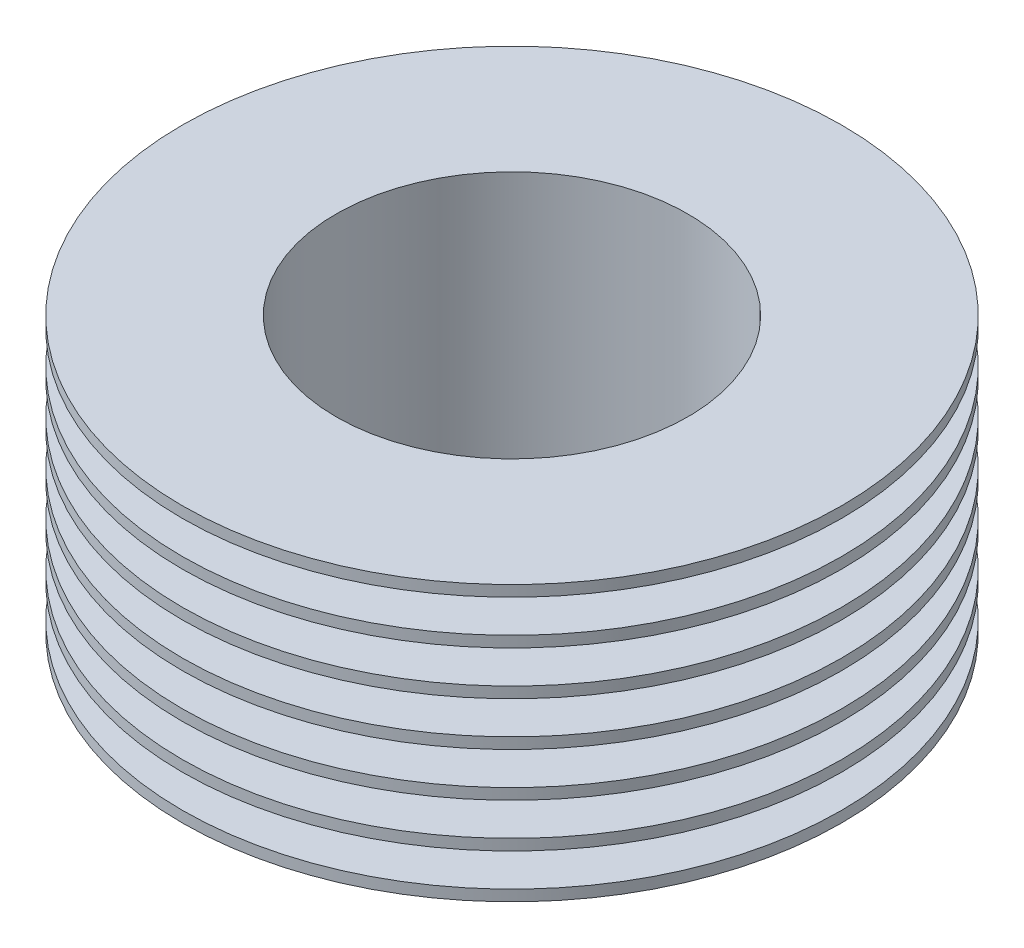
ISO-10303-21;
HEADER;
FILE_DESCRIPTION(('STEP AP214'),'2;1');
FILE_NAME('part.step','',(''),(''),'','','');
FILE_SCHEMA(('AUTOMOTIVE_DESIGN { 1 0 10303 214 1 1 1 1 }'));
ENDSEC;
DATA;
#1=APPLICATION_CONTEXT('core data for automotive mechanical design processes');
#2=APPLICATION_PROTOCOL_DEFINITION('international standard','automotive_design',2000,#1);
#3=PRODUCT_CONTEXT('',#1,'mechanical');
#4=PRODUCT('Part','Part','',(#3));
#5=PRODUCT_RELATED_PRODUCT_CATEGORY('part','',(#4));
#6=PRODUCT_DEFINITION_FORMATION('','',#4);
#7=PRODUCT_DEFINITION_CONTEXT('part definition',#1,'design');
#8=PRODUCT_DEFINITION('design','',#6,#7);
#9=PRODUCT_DEFINITION_SHAPE('','',#8);
#10=(LENGTH_UNIT() NAMED_UNIT(*) SI_UNIT(.MILLI.,.METRE.));
#11=(NAMED_UNIT(*) PLANE_ANGLE_UNIT() SI_UNIT($,.RADIAN.));
#12=(NAMED_UNIT(*) SI_UNIT($,.STERADIAN.) SOLID_ANGLE_UNIT());
#13=UNCERTAINTY_MEASURE_WITH_UNIT(LENGTH_MEASURE(1.E-05),#10,'distance_accuracy_value','');
#14=(GEOMETRIC_REPRESENTATION_CONTEXT(3) GLOBAL_UNCERTAINTY_ASSIGNED_CONTEXT((#13)) GLOBAL_UNIT_ASSIGNED_CONTEXT((#10,
#11,#12)) REPRESENTATION_CONTEXT('',''));
#15=CARTESIAN_POINT('',(0.,0.,0.));
#16=DIRECTION('',(0.,0.,1.));
#17=DIRECTION('',(1.,0.,0.));
#18=AXIS2_PLACEMENT_3D('',#15,#16,#17);
#19=CARTESIAN_POINT('',(0.,28.0586262240942,0.));
#20=DIRECTION('',(0.,1.,0.));
#21=DIRECTION('',(0.,0.,1.));
#22=AXIS2_PLACEMENT_3D('',#19,#20,#21);
#23=CYLINDRICAL_SURFACE('',#22,16.);
#24=CARTESIAN_POINT('',(0.,8.83865887189124,0.));
#25=DIRECTION('',(0.,1.,0.));
#26=DIRECTION('',(0.,0.,1.));
#27=AXIS2_PLACEMENT_3D('',#24,#25,#26);
#28=CIRCLE('',#27,16.);
#29=CARTESIAN_POINT('',(0.,8.83865887189124,16.));
#30=VERTEX_POINT('',#29);
#31=EDGE_CURVE('E67',#30,#30,#28,.T.);
#32=ORIENTED_EDGE('',*,*,#31,.F.);
#33=EDGE_LOOP('',(#32));
#34=FACE_BOUND('',#33,.T.);
#35=CARTESIAN_POINT('',(0.,33.8386588718912,0.));
#36=DIRECTION('',(0.,1.,0.));
#37=DIRECTION('',(0.,0.,1.));
#38=AXIS2_PLACEMENT_3D('',#35,#36,#37);
#39=CIRCLE('',#38,16.);
#40=CARTESIAN_POINT('',(0.,33.8386588718912,16.));
#41=VERTEX_POINT('',#40);
#42=EDGE_CURVE('E123',#41,#41,#39,.T.);
#43=ORIENTED_EDGE('',*,*,#42,.T.);
#44=EDGE_LOOP('',(#43));
#45=FACE_BOUND('',#44,.T.);
#46=ADVANCED_FACE('F34',(#34,#45),#23,.F.);
#47=CARTESIAN_POINT('',(0.,28.0586262240942,0.));
#48=DIRECTION('',(0.,1.,0.));
#49=DIRECTION('',(0.,0.,1.));
#50=AXIS2_PLACEMENT_3D('',#47,#48,#49);
#51=CYLINDRICAL_SURFACE('',#50,18.);
#52=CARTESIAN_POINT('',(0.,12.8386588718912,0.));
#53=DIRECTION('',(0.,-1.,0.));
#54=DIRECTION('',(0.,0.,-1.));
#55=AXIS2_PLACEMENT_3D('',#52,#53,#54);
#56=CIRCLE('',#55,18.);
#57=CARTESIAN_POINT('',(0.,12.8386588718912,-18.));
#58=VERTEX_POINT('',#57);
#59=EDGE_CURVE('E57',#58,#58,#56,.F.);
#60=ORIENTED_EDGE('',*,*,#59,.F.);
#61=EDGE_LOOP('',(#60));
#62=FACE_BOUND('',#61,.T.);
#63=CARTESIAN_POINT('',(0.,9.83865887189124,0.));
#64=DIRECTION('',(0.,1.,0.));
#65=DIRECTION('',(0.,0.,1.));
#66=AXIS2_PLACEMENT_3D('',#63,#64,#65);
#67=CIRCLE('',#66,18.);
#68=CARTESIAN_POINT('',(0.,9.83865887189124,18.));
#69=VERTEX_POINT('',#68);
#70=EDGE_CURVE('E58',#69,#69,#67,.T.);
#71=ORIENTED_EDGE('',*,*,#70,.T.);
#72=EDGE_LOOP('',(#71));
#73=FACE_BOUND('',#72,.T.);
#74=ADVANCED_FACE('F36',(#62,#73),#51,.T.);
#75=CARTESIAN_POINT('',(0.,9.83865887189124,18.));
#76=DIRECTION('',(0.,1.,0.));
#77=DIRECTION('',(0.,0.,1.));
#78=AXIS2_PLACEMENT_3D('',#75,#76,#77);
#79=PLANE('',#78);
#80=CARTESIAN_POINT('',(0.,9.83865887189124,0.));
#81=DIRECTION('',(0.,1.,0.));
#82=DIRECTION('',(0.,0.,1.));
#83=AXIS2_PLACEMENT_3D('',#80,#81,#82);
#84=CIRCLE('',#83,30.);
#85=CARTESIAN_POINT('',(0.,9.83865887189124,30.));
#86=VERTEX_POINT('',#85);
#87=EDGE_CURVE('E61',#86,#86,#84,.T.);
#88=ORIENTED_EDGE('',*,*,#87,.T.);
#89=EDGE_LOOP('',(#88));
#90=FACE_BOUND('',#89,.T.);
#91=ORIENTED_EDGE('',*,*,#70,.F.);
#92=EDGE_LOOP('',(#91));
#93=FACE_BOUND('',#92,.T.);
#94=ADVANCED_FACE('F149',(#90,#93),#79,.T.);
#95=CARTESIAN_POINT('',(0.,28.0586262240942,0.));
#96=DIRECTION('',(0.,1.,0.));
#97=DIRECTION('',(0.,0.,1.));
#98=AXIS2_PLACEMENT_3D('',#95,#96,#97);
#99=CYLINDRICAL_SURFACE('',#98,30.);
#100=CARTESIAN_POINT('',(0.,8.83865887189124,0.));
#101=DIRECTION('',(0.,1.,0.));
#102=DIRECTION('',(0.,0.,1.));
#103=AXIS2_PLACEMENT_3D('',#100,#101,#102);
#104=CIRCLE('',#103,30.);
#105=CARTESIAN_POINT('',(0.,8.83865887189124,30.));
#106=VERTEX_POINT('',#105);
#107=EDGE_CURVE('E64',#106,#106,#104,.T.);
#108=ORIENTED_EDGE('',*,*,#107,.T.);
#109=EDGE_LOOP('',(#108));
#110=FACE_BOUND('',#109,.T.);
#111=ORIENTED_EDGE('',*,*,#87,.F.);
#112=EDGE_LOOP('',(#111));
#113=FACE_BOUND('',#112,.T.);
#114=ADVANCED_FACE('F159',(#110,#113),#99,.T.);
#115=CARTESIAN_POINT('',(0.,8.83865887189124,30.));
#116=DIRECTION('',(0.,-1.,0.));
#117=DIRECTION('',(0.,0.,-1.));
#118=AXIS2_PLACEMENT_3D('',#115,#116,#117);
#119=PLANE('',#118);
#120=ORIENTED_EDGE('',*,*,#31,.T.);
#121=EDGE_LOOP('',(#120));
#122=FACE_BOUND('',#121,.T.);
#123=ORIENTED_EDGE('',*,*,#107,.F.);
#124=EDGE_LOOP('',(#123));
#125=FACE_BOUND('',#124,.T.);
#126=ADVANCED_FACE('F156',(#122,#125),#119,.T.);
#127=CARTESIAN_POINT('',(0.,32.0586262240942,0.));
#128=DIRECTION('',(0.,1.,0.));
#129=DIRECTION('',(0.,0.,1.));
#130=AXIS2_PLACEMENT_3D('',#127,#128,#129);
#131=CYLINDRICAL_SURFACE('',#130,18.);
#132=CARTESIAN_POINT('',(0.,16.8386588718912,0.));
#133=DIRECTION('',(0.,-1.,0.));
#134=DIRECTION('',(0.,0.,-1.));
#135=AXIS2_PLACEMENT_3D('',#132,#133,#134);
#136=CIRCLE('',#135,18.);
#137=CARTESIAN_POINT('',(0.,16.8386588718912,-18.));
#138=VERTEX_POINT('',#137);
#139=EDGE_CURVE('E54',#138,#138,#136,.F.);
#140=ORIENTED_EDGE('',*,*,#139,.F.);
#141=EDGE_LOOP('',(#140));
#142=FACE_BOUND('',#141,.T.);
#143=CARTESIAN_POINT('',(0.,13.8386588718912,0.));
#144=DIRECTION('',(0.,1.,0.));
#145=DIRECTION('',(0.,0.,1.));
#146=AXIS2_PLACEMENT_3D('',#143,#144,#145);
#147=CIRCLE('',#146,18.);
#148=CARTESIAN_POINT('',(0.,13.8386588718912,18.));
#149=VERTEX_POINT('',#148);
#150=EDGE_CURVE('E70',#149,#149,#147,.T.);
#151=ORIENTED_EDGE('',*,*,#150,.T.);
#152=EDGE_LOOP('',(#151));
#153=FACE_BOUND('',#152,.T.);
#154=ADVANCED_FACE('F154',(#142,#153),#131,.T.);
#155=CARTESIAN_POINT('',(0.,13.8386588718912,18.));
#156=DIRECTION('',(0.,1.,0.));
#157=DIRECTION('',(0.,0.,1.));
#158=AXIS2_PLACEMENT_3D('',#155,#156,#157);
#159=PLANE('',#158);
#160=CARTESIAN_POINT('',(0.,13.8386588718912,0.));
#161=DIRECTION('',(0.,1.,0.));
#162=DIRECTION('',(0.,0.,1.));
#163=AXIS2_PLACEMENT_3D('',#160,#161,#162);
#164=CIRCLE('',#163,30.);
#165=CARTESIAN_POINT('',(0.,13.8386588718912,30.));
#166=VERTEX_POINT('',#165);
#167=EDGE_CURVE('E75',#166,#166,#164,.T.);
#168=ORIENTED_EDGE('',*,*,#167,.T.);
#169=EDGE_LOOP('',(#168));
#170=FACE_BOUND('',#169,.T.);
#171=ORIENTED_EDGE('',*,*,#150,.F.);
#172=EDGE_LOOP('',(#171));
#173=FACE_BOUND('',#172,.T.);
#174=ADVANCED_FACE('F188',(#170,#173),#159,.T.);
#175=CARTESIAN_POINT('',(0.,32.0586262240942,0.));
#176=DIRECTION('',(0.,1.,0.));
#177=DIRECTION('',(0.,0.,1.));
#178=AXIS2_PLACEMENT_3D('',#175,#176,#177);
#179=CYLINDRICAL_SURFACE('',#178,30.);
#180=CARTESIAN_POINT('',(0.,12.8386588718912,0.));
#181=DIRECTION('',(0.,1.,0.));
#182=DIRECTION('',(0.,0.,1.));
#183=AXIS2_PLACEMENT_3D('',#180,#181,#182);
#184=CIRCLE('',#183,30.);
#185=CARTESIAN_POINT('',(0.,12.8386588718912,30.));
#186=VERTEX_POINT('',#185);
#187=EDGE_CURVE('E78',#186,#186,#184,.T.);
#188=ORIENTED_EDGE('',*,*,#187,.T.);
#189=EDGE_LOOP('',(#188));
#190=FACE_BOUND('',#189,.T.);
#191=ORIENTED_EDGE('',*,*,#167,.F.);
#192=EDGE_LOOP('',(#191));
#193=FACE_BOUND('',#192,.T.);
#194=ADVANCED_FACE('F195',(#190,#193),#179,.T.);
#195=CARTESIAN_POINT('',(0.,12.8386588718912,30.));
#196=DIRECTION('',(0.,-1.,0.));
#197=DIRECTION('',(0.,0.,-1.));
#198=AXIS2_PLACEMENT_3D('',#195,#196,#197);
#199=PLANE('',#198);
#200=ORIENTED_EDGE('',*,*,#59,.T.);
#201=EDGE_LOOP('',(#200));
#202=FACE_BOUND('',#201,.T.);
#203=ORIENTED_EDGE('',*,*,#187,.F.);
#204=EDGE_LOOP('',(#203));
#205=FACE_BOUND('',#204,.T.);
#206=ADVANCED_FACE('F202',(#202,#205),#199,.T.);
#207=CARTESIAN_POINT('',(0.,36.0586262240942,0.));
#208=DIRECTION('',(0.,1.,0.));
#209=DIRECTION('',(0.,0.,1.));
#210=AXIS2_PLACEMENT_3D('',#207,#208,#209);
#211=CYLINDRICAL_SURFACE('',#210,18.);
#212=CARTESIAN_POINT('',(0.,20.8386588718912,0.));
#213=DIRECTION('',(0.,-1.,0.));
#214=DIRECTION('',(0.,0.,-1.));
#215=AXIS2_PLACEMENT_3D('',#212,#213,#214);
#216=CIRCLE('',#215,18.);
#217=CARTESIAN_POINT('',(0.,20.8386588718912,-18.));
#218=VERTEX_POINT('',#217);
#219=EDGE_CURVE('E49',#218,#218,#216,.F.);
#220=ORIENTED_EDGE('',*,*,#219,.F.);
#221=EDGE_LOOP('',(#220));
#222=FACE_BOUND('',#221,.T.);
#223=CARTESIAN_POINT('',(0.,17.8386588718912,0.));
#224=DIRECTION('',(0.,1.,0.));
#225=DIRECTION('',(0.,0.,1.));
#226=AXIS2_PLACEMENT_3D('',#223,#224,#225);
#227=CIRCLE('',#226,18.);
#228=CARTESIAN_POINT('',(0.,17.8386588718912,18.));
#229=VERTEX_POINT('',#228);
#230=EDGE_CURVE('E81',#229,#229,#227,.T.);
#231=ORIENTED_EDGE('',*,*,#230,.T.);
#232=EDGE_LOOP('',(#231));
#233=FACE_BOUND('',#232,.T.);
#234=ADVANCED_FACE('F210',(#222,#233),#211,.T.);
#235=CARTESIAN_POINT('',(0.,17.8386588718912,18.));
#236=DIRECTION('',(0.,1.,0.));
#237=DIRECTION('',(0.,0.,1.));
#238=AXIS2_PLACEMENT_3D('',#235,#236,#237);
#239=PLANE('',#238);
#240=CARTESIAN_POINT('',(0.,17.8386588718912,0.));
#241=DIRECTION('',(0.,1.,0.));
#242=DIRECTION('',(0.,0.,1.));
#243=AXIS2_PLACEMENT_3D('',#240,#241,#242);
#244=CIRCLE('',#243,30.);
#245=CARTESIAN_POINT('',(0.,17.8386588718912,30.));
#246=VERTEX_POINT('',#245);
#247=EDGE_CURVE('E84',#246,#246,#244,.T.);
#248=ORIENTED_EDGE('',*,*,#247,.T.);
#249=EDGE_LOOP('',(#248));
#250=FACE_BOUND('',#249,.T.);
#251=ORIENTED_EDGE('',*,*,#230,.F.);
#252=EDGE_LOOP('',(#251));
#253=FACE_BOUND('',#252,.T.);
#254=ADVANCED_FACE('F218',(#250,#253),#239,.T.);
#255=CARTESIAN_POINT('',(0.,36.0586262240942,0.));
#256=DIRECTION('',(0.,1.,0.));
#257=DIRECTION('',(0.,0.,1.));
#258=AXIS2_PLACEMENT_3D('',#255,#256,#257);
#259=CYLINDRICAL_SURFACE('',#258,30.);
#260=CARTESIAN_POINT('',(0.,16.8386588718912,0.));
#261=DIRECTION('',(0.,1.,0.));
#262=DIRECTION('',(0.,0.,1.));
#263=AXIS2_PLACEMENT_3D('',#260,#261,#262);
#264=CIRCLE('',#263,30.);
#265=CARTESIAN_POINT('',(0.,16.8386588718912,30.));
#266=VERTEX_POINT('',#265);
#267=EDGE_CURVE('E87',#266,#266,#264,.T.);
#268=ORIENTED_EDGE('',*,*,#267,.T.);
#269=EDGE_LOOP('',(#268));
#270=FACE_BOUND('',#269,.T.);
#271=ORIENTED_EDGE('',*,*,#247,.F.);
#272=EDGE_LOOP('',(#271));
#273=FACE_BOUND('',#272,.T.);
#274=ADVANCED_FACE('F226',(#270,#273),#259,.T.);
#275=CARTESIAN_POINT('',(0.,16.8386588718912,30.));
#276=DIRECTION('',(0.,-1.,0.));
#277=DIRECTION('',(0.,0.,-1.));
#278=AXIS2_PLACEMENT_3D('',#275,#276,#277);
#279=PLANE('',#278);
#280=ORIENTED_EDGE('',*,*,#139,.T.);
#281=EDGE_LOOP('',(#280));
#282=FACE_BOUND('',#281,.T.);
#283=ORIENTED_EDGE('',*,*,#267,.F.);
#284=EDGE_LOOP('',(#283));
#285=FACE_BOUND('',#284,.T.);
#286=ADVANCED_FACE('F234',(#282,#285),#279,.T.);
#287=CARTESIAN_POINT('',(0.,40.0586262240942,0.));
#288=DIRECTION('',(0.,1.,0.));
#289=DIRECTION('',(0.,0.,1.));
#290=AXIS2_PLACEMENT_3D('',#287,#288,#289);
#291=CYLINDRICAL_SURFACE('',#290,18.);
#292=CARTESIAN_POINT('',(0.,24.8386588718912,0.));
#293=DIRECTION('',(0.,-1.,0.));
#294=DIRECTION('',(0.,0.,-1.));
#295=AXIS2_PLACEMENT_3D('',#292,#293,#294);
#296=CIRCLE('',#295,18.);
#297=CARTESIAN_POINT('',(0.,24.8386588718912,-18.));
#298=VERTEX_POINT('',#297);
#299=EDGE_CURVE('E45',#298,#298,#296,.F.);
#300=ORIENTED_EDGE('',*,*,#299,.F.);
#301=EDGE_LOOP('',(#300));
#302=FACE_BOUND('',#301,.T.);
#303=CARTESIAN_POINT('',(0.,21.8386588718912,0.));
#304=DIRECTION('',(0.,1.,0.));
#305=DIRECTION('',(0.,0.,1.));
#306=AXIS2_PLACEMENT_3D('',#303,#304,#305);
#307=CIRCLE('',#306,18.);
#308=CARTESIAN_POINT('',(0.,21.8386588718912,18.));
#309=VERTEX_POINT('',#308);
#310=EDGE_CURVE('E90',#309,#309,#307,.T.);
#311=ORIENTED_EDGE('',*,*,#310,.T.);
#312=EDGE_LOOP('',(#311));
#313=FACE_BOUND('',#312,.T.);
#314=ADVANCED_FACE('F242',(#302,#313),#291,.T.);
#315=CARTESIAN_POINT('',(0.,21.8386588718912,18.));
#316=DIRECTION('',(0.,1.,0.));
#317=DIRECTION('',(0.,0.,1.));
#318=AXIS2_PLACEMENT_3D('',#315,#316,#317);
#319=PLANE('',#318);
#320=CARTESIAN_POINT('',(0.,21.8386588718912,0.));
#321=DIRECTION('',(0.,1.,0.));
#322=DIRECTION('',(0.,0.,1.));
#323=AXIS2_PLACEMENT_3D('',#320,#321,#322);
#324=CIRCLE('',#323,30.);
#325=CARTESIAN_POINT('',(0.,21.8386588718912,30.));
#326=VERTEX_POINT('',#325);
#327=EDGE_CURVE('E93',#326,#326,#324,.T.);
#328=ORIENTED_EDGE('',*,*,#327,.T.);
#329=EDGE_LOOP('',(#328));
#330=FACE_BOUND('',#329,.T.);
#331=ORIENTED_EDGE('',*,*,#310,.F.);
#332=EDGE_LOOP('',(#331));
#333=FACE_BOUND('',#332,.T.);
#334=ADVANCED_FACE('F250',(#330,#333),#319,.T.);
#335=CARTESIAN_POINT('',(0.,40.0586262240942,0.));
#336=DIRECTION('',(0.,1.,0.));
#337=DIRECTION('',(0.,0.,1.));
#338=AXIS2_PLACEMENT_3D('',#335,#336,#337);
#339=CYLINDRICAL_SURFACE('',#338,30.);
#340=CARTESIAN_POINT('',(0.,20.8386588718912,0.));
#341=DIRECTION('',(0.,1.,0.));
#342=DIRECTION('',(0.,0.,1.));
#343=AXIS2_PLACEMENT_3D('',#340,#341,#342);
#344=CIRCLE('',#343,30.);
#345=CARTESIAN_POINT('',(0.,20.8386588718912,30.));
#346=VERTEX_POINT('',#345);
#347=EDGE_CURVE('E96',#346,#346,#344,.T.);
#348=ORIENTED_EDGE('',*,*,#347,.T.);
#349=EDGE_LOOP('',(#348));
#350=FACE_BOUND('',#349,.T.);
#351=ORIENTED_EDGE('',*,*,#327,.F.);
#352=EDGE_LOOP('',(#351));
#353=FACE_BOUND('',#352,.T.);
#354=ADVANCED_FACE('F258',(#350,#353),#339,.T.);
#355=CARTESIAN_POINT('',(0.,20.8386588718912,30.));
#356=DIRECTION('',(0.,-1.,0.));
#357=DIRECTION('',(0.,0.,-1.));
#358=AXIS2_PLACEMENT_3D('',#355,#356,#357);
#359=PLANE('',#358);
#360=ORIENTED_EDGE('',*,*,#219,.T.);
#361=EDGE_LOOP('',(#360));
#362=FACE_BOUND('',#361,.T.);
#363=ORIENTED_EDGE('',*,*,#347,.F.);
#364=EDGE_LOOP('',(#363));
#365=FACE_BOUND('',#364,.T.);
#366=ADVANCED_FACE('F266',(#362,#365),#359,.T.);
#367=CARTESIAN_POINT('',(0.,44.0586262240942,0.));
#368=DIRECTION('',(0.,1.,0.));
#369=DIRECTION('',(0.,0.,1.));
#370=AXIS2_PLACEMENT_3D('',#367,#368,#369);
#371=CYLINDRICAL_SURFACE('',#370,18.);
#372=CARTESIAN_POINT('',(0.,28.8386588718912,0.));
#373=DIRECTION('',(0.,-1.,0.));
#374=DIRECTION('',(0.,0.,-1.));
#375=AXIS2_PLACEMENT_3D('',#372,#373,#374);
#376=CIRCLE('',#375,18.);
#377=CARTESIAN_POINT('',(0.,28.8386588718912,-18.));
#378=VERTEX_POINT('',#377);
#379=EDGE_CURVE('E41',#378,#378,#376,.F.);
#380=ORIENTED_EDGE('',*,*,#379,.F.);
#381=EDGE_LOOP('',(#380));
#382=FACE_BOUND('',#381,.T.);
#383=CARTESIAN_POINT('',(0.,25.8386588718912,0.));
#384=DIRECTION('',(0.,1.,0.));
#385=DIRECTION('',(0.,0.,1.));
#386=AXIS2_PLACEMENT_3D('',#383,#384,#385);
#387=CIRCLE('',#386,18.);
#388=CARTESIAN_POINT('',(0.,25.8386588718912,18.));
#389=VERTEX_POINT('',#388);
#390=EDGE_CURVE('E99',#389,#389,#387,.T.);
#391=ORIENTED_EDGE('',*,*,#390,.T.);
#392=EDGE_LOOP('',(#391));
#393=FACE_BOUND('',#392,.T.);
#394=ADVANCED_FACE('F274',(#382,#393),#371,.T.);
#395=CARTESIAN_POINT('',(0.,25.8386588718912,18.));
#396=DIRECTION('',(0.,1.,0.));
#397=DIRECTION('',(0.,0.,1.));
#398=AXIS2_PLACEMENT_3D('',#395,#396,#397);
#399=PLANE('',#398);
#400=CARTESIAN_POINT('',(0.,25.8386588718912,0.));
#401=DIRECTION('',(0.,1.,0.));
#402=DIRECTION('',(0.,0.,1.));
#403=AXIS2_PLACEMENT_3D('',#400,#401,#402);
#404=CIRCLE('',#403,30.);
#405=CARTESIAN_POINT('',(0.,25.8386588718912,30.));
#406=VERTEX_POINT('',#405);
#407=EDGE_CURVE('E102',#406,#406,#404,.T.);
#408=ORIENTED_EDGE('',*,*,#407,.T.);
#409=EDGE_LOOP('',(#408));
#410=FACE_BOUND('',#409,.T.);
#411=ORIENTED_EDGE('',*,*,#390,.F.);
#412=EDGE_LOOP('',(#411));
#413=FACE_BOUND('',#412,.T.);
#414=ADVANCED_FACE('F282',(#410,#413),#399,.T.);
#415=CARTESIAN_POINT('',(0.,44.0586262240942,0.));
#416=DIRECTION('',(0.,1.,0.));
#417=DIRECTION('',(0.,0.,1.));
#418=AXIS2_PLACEMENT_3D('',#415,#416,#417);
#419=CYLINDRICAL_SURFACE('',#418,30.);
#420=CARTESIAN_POINT('',(0.,24.8386588718912,0.));
#421=DIRECTION('',(0.,1.,0.));
#422=DIRECTION('',(0.,0.,1.));
#423=AXIS2_PLACEMENT_3D('',#420,#421,#422);
#424=CIRCLE('',#423,30.);
#425=CARTESIAN_POINT('',(0.,24.8386588718912,30.));
#426=VERTEX_POINT('',#425);
#427=EDGE_CURVE('E105',#426,#426,#424,.T.);
#428=ORIENTED_EDGE('',*,*,#427,.T.);
#429=EDGE_LOOP('',(#428));
#430=FACE_BOUND('',#429,.T.);
#431=ORIENTED_EDGE('',*,*,#407,.F.);
#432=EDGE_LOOP('',(#431));
#433=FACE_BOUND('',#432,.T.);
#434=ADVANCED_FACE('F290',(#430,#433),#419,.T.);
#435=CARTESIAN_POINT('',(0.,24.8386588718912,30.));
#436=DIRECTION('',(0.,-1.,0.));
#437=DIRECTION('',(0.,0.,-1.));
#438=AXIS2_PLACEMENT_3D('',#435,#436,#437);
#439=PLANE('',#438);
#440=ORIENTED_EDGE('',*,*,#299,.T.);
#441=EDGE_LOOP('',(#440));
#442=FACE_BOUND('',#441,.T.);
#443=ORIENTED_EDGE('',*,*,#427,.F.);
#444=EDGE_LOOP('',(#443));
#445=FACE_BOUND('',#444,.T.);
#446=ADVANCED_FACE('F298',(#442,#445),#439,.T.);
#447=CARTESIAN_POINT('',(0.,48.0586262240942,0.));
#448=DIRECTION('',(0.,1.,0.));
#449=DIRECTION('',(0.,0.,1.));
#450=AXIS2_PLACEMENT_3D('',#447,#448,#449);
#451=CYLINDRICAL_SURFACE('',#450,18.);
#452=CARTESIAN_POINT('',(0.,32.8386588718912,0.));
#453=DIRECTION('',(0.,-1.,0.));
#454=DIRECTION('',(0.,0.,-1.));
#455=AXIS2_PLACEMENT_3D('',#452,#453,#454);
#456=CIRCLE('',#455,18.);
#457=CARTESIAN_POINT('',(0.,32.8386588718912,-18.));
#458=VERTEX_POINT('',#457);
#459=EDGE_CURVE('E10',#458,#458,#456,.F.);
#460=ORIENTED_EDGE('',*,*,#459,.F.);
#461=EDGE_LOOP('',(#460));
#462=FACE_BOUND('',#461,.T.);
#463=CARTESIAN_POINT('',(0.,29.8386588718912,0.));
#464=DIRECTION('',(0.,1.,0.));
#465=DIRECTION('',(0.,0.,1.));
#466=AXIS2_PLACEMENT_3D('',#463,#464,#465);
#467=CIRCLE('',#466,18.);
#468=CARTESIAN_POINT('',(0.,29.8386588718912,18.));
#469=VERTEX_POINT('',#468);
#470=EDGE_CURVE('E108',#469,#469,#467,.T.);
#471=ORIENTED_EDGE('',*,*,#470,.T.);
#472=EDGE_LOOP('',(#471));
#473=FACE_BOUND('',#472,.T.);
#474=ADVANCED_FACE('F306',(#462,#473),#451,.T.);
#475=CARTESIAN_POINT('',(0.,29.8386588718912,18.));
#476=DIRECTION('',(0.,1.,0.));
#477=DIRECTION('',(0.,0.,1.));
#478=AXIS2_PLACEMENT_3D('',#475,#476,#477);
#479=PLANE('',#478);
#480=CARTESIAN_POINT('',(0.,29.8386588718912,0.));
#481=DIRECTION('',(0.,1.,0.));
#482=DIRECTION('',(0.,0.,1.));
#483=AXIS2_PLACEMENT_3D('',#480,#481,#482);
#484=CIRCLE('',#483,30.);
#485=CARTESIAN_POINT('',(0.,29.8386588718912,30.));
#486=VERTEX_POINT('',#485);
#487=EDGE_CURVE('E111',#486,#486,#484,.T.);
#488=ORIENTED_EDGE('',*,*,#487,.T.);
#489=EDGE_LOOP('',(#488));
#490=FACE_BOUND('',#489,.T.);
#491=ORIENTED_EDGE('',*,*,#470,.F.);
#492=EDGE_LOOP('',(#491));
#493=FACE_BOUND('',#492,.T.);
#494=ADVANCED_FACE('F314',(#490,#493),#479,.T.);
#495=CARTESIAN_POINT('',(0.,48.0586262240942,0.));
#496=DIRECTION('',(0.,1.,0.));
#497=DIRECTION('',(0.,0.,1.));
#498=AXIS2_PLACEMENT_3D('',#495,#496,#497);
#499=CYLINDRICAL_SURFACE('',#498,30.);
#500=CARTESIAN_POINT('',(0.,28.8386588718912,0.));
#501=DIRECTION('',(0.,1.,0.));
#502=DIRECTION('',(0.,0.,1.));
#503=AXIS2_PLACEMENT_3D('',#500,#501,#502);
#504=CIRCLE('',#503,30.);
#505=CARTESIAN_POINT('',(0.,28.8386588718912,30.));
#506=VERTEX_POINT('',#505);
#507=EDGE_CURVE('E114',#506,#506,#504,.T.);
#508=ORIENTED_EDGE('',*,*,#507,.T.);
#509=EDGE_LOOP('',(#508));
#510=FACE_BOUND('',#509,.T.);
#511=ORIENTED_EDGE('',*,*,#487,.F.);
#512=EDGE_LOOP('',(#511));
#513=FACE_BOUND('',#512,.T.);
#514=ADVANCED_FACE('F141',(#510,#513),#499,.T.);
#515=CARTESIAN_POINT('',(0.,28.8386588718912,30.));
#516=DIRECTION('',(0.,-1.,0.));
#517=DIRECTION('',(0.,0.,-1.));
#518=AXIS2_PLACEMENT_3D('',#515,#516,#517);
#519=PLANE('',#518);
#520=ORIENTED_EDGE('',*,*,#379,.T.);
#521=EDGE_LOOP('',(#520));
#522=FACE_BOUND('',#521,.T.);
#523=ORIENTED_EDGE('',*,*,#507,.F.);
#524=EDGE_LOOP('',(#523));
#525=FACE_BOUND('',#524,.T.);
#526=ADVANCED_FACE('F131',(#522,#525),#519,.T.);
#527=CARTESIAN_POINT('',(0.,33.8386588718912,18.));
#528=DIRECTION('',(0.,1.,0.));
#529=DIRECTION('',(0.,0.,1.));
#530=AXIS2_PLACEMENT_3D('',#527,#528,#529);
#531=PLANE('',#530);
#532=CARTESIAN_POINT('',(0.,33.8386588718912,0.));
#533=DIRECTION('',(0.,1.,0.));
#534=DIRECTION('',(0.,0.,1.));
#535=AXIS2_PLACEMENT_3D('',#532,#533,#534);
#536=CIRCLE('',#535,30.);
#537=CARTESIAN_POINT('',(0.,33.8386588718912,30.));
#538=VERTEX_POINT('',#537);
#539=EDGE_CURVE('E117',#538,#538,#536,.T.);
#540=ORIENTED_EDGE('',*,*,#539,.T.);
#541=EDGE_LOOP('',(#540));
#542=FACE_BOUND('',#541,.T.);
#543=ORIENTED_EDGE('',*,*,#42,.F.);
#544=EDGE_LOOP('',(#543));
#545=FACE_BOUND('',#544,.T.);
#546=ADVANCED_FACE('F128',(#542,#545),#531,.T.);
#547=CARTESIAN_POINT('',(0.,52.0586262240942,0.));
#548=DIRECTION('',(0.,1.,0.));
#549=DIRECTION('',(0.,0.,1.));
#550=AXIS2_PLACEMENT_3D('',#547,#548,#549);
#551=CYLINDRICAL_SURFACE('',#550,30.);
#552=CARTESIAN_POINT('',(0.,32.8386588718912,0.));
#553=DIRECTION('',(0.,1.,0.));
#554=DIRECTION('',(0.,0.,1.));
#555=AXIS2_PLACEMENT_3D('',#552,#553,#554);
#556=CIRCLE('',#555,30.);
#557=CARTESIAN_POINT('',(0.,32.8386588718912,30.));
#558=VERTEX_POINT('',#557);
#559=EDGE_CURVE('E120',#558,#558,#556,.T.);
#560=ORIENTED_EDGE('',*,*,#559,.T.);
#561=EDGE_LOOP('',(#560));
#562=FACE_BOUND('',#561,.T.);
#563=ORIENTED_EDGE('',*,*,#539,.F.);
#564=EDGE_LOOP('',(#563));
#565=FACE_BOUND('',#564,.T.);
#566=ADVANCED_FACE('F130',(#562,#565),#551,.T.);
#567=CARTESIAN_POINT('',(0.,32.8386588718912,30.));
#568=DIRECTION('',(0.,-1.,0.));
#569=DIRECTION('',(0.,0.,-1.));
#570=AXIS2_PLACEMENT_3D('',#567,#568,#569);
#571=PLANE('',#570);
#572=ORIENTED_EDGE('',*,*,#459,.T.);
#573=EDGE_LOOP('',(#572));
#574=FACE_BOUND('',#573,.T.);
#575=ORIENTED_EDGE('',*,*,#559,.F.);
#576=EDGE_LOOP('',(#575));
#577=FACE_BOUND('',#576,.T.);
#578=ADVANCED_FACE('F138',(#574,#577),#571,.T.);
#579=CLOSED_SHELL('',(#46,#74,#94,#114,#126,#154,#174,#194,#206,#234,#254,#274,#286,#314,#334,
#354,#366,#394,#414,#434,#446,#474,#494,#514,#526,#546,#566,#578));
#580=MANIFOLD_SOLID_BREP('B2',#579);
#581=ADVANCED_BREP_SHAPE_REPRESENTATION('',(#18,#580),#14);
#582=SHAPE_DEFINITION_REPRESENTATION(#9,#581);
ENDSEC;
END-ISO-10303-21;
